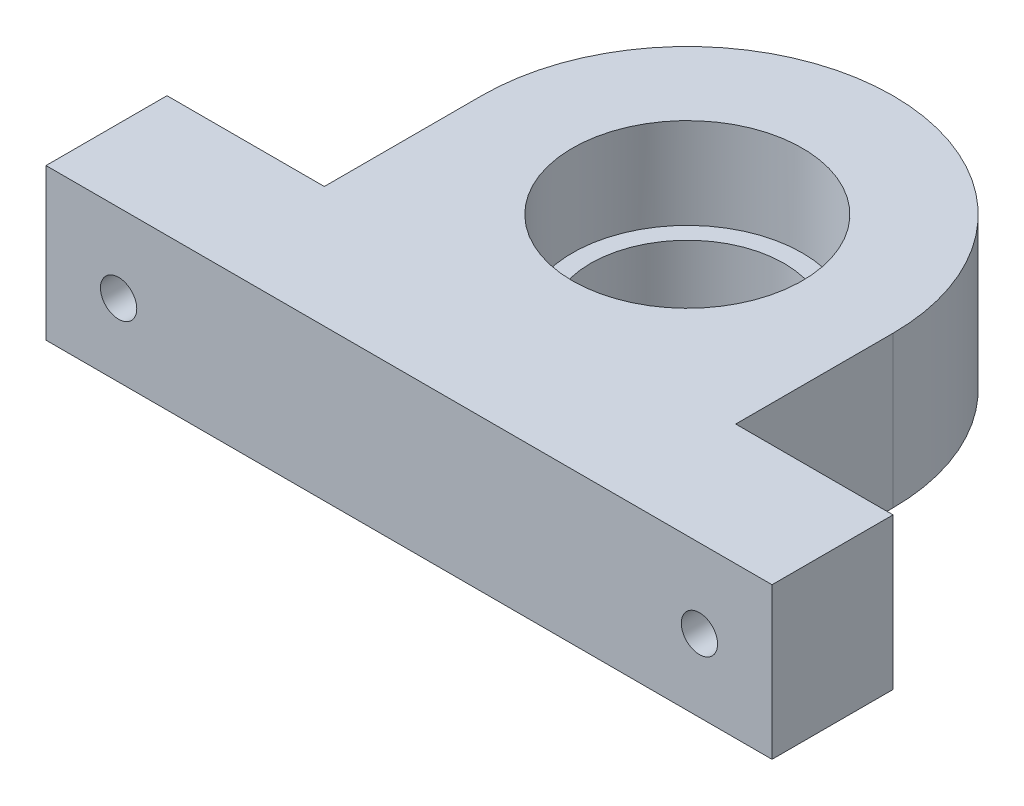
ISO-10303-21;
HEADER;
FILE_DESCRIPTION(('STEP AP214'),'2;1');
FILE_NAME('part.step','',(''),(''),'','','');
FILE_SCHEMA(('AUTOMOTIVE_DESIGN { 1 0 10303 214 1 1 1 1 }'));
ENDSEC;
DATA;
#1=APPLICATION_CONTEXT('core data for automotive mechanical design processes');
#2=APPLICATION_PROTOCOL_DEFINITION('international standard','automotive_design',2000,#1);
#3=PRODUCT_CONTEXT('',#1,'mechanical');
#4=PRODUCT('Part','Part','',(#3));
#5=PRODUCT_RELATED_PRODUCT_CATEGORY('part','',(#4));
#6=PRODUCT_DEFINITION_FORMATION('','',#4);
#7=PRODUCT_DEFINITION_CONTEXT('part definition',#1,'design');
#8=PRODUCT_DEFINITION('design','',#6,#7);
#9=PRODUCT_DEFINITION_SHAPE('','',#8);
#10=(LENGTH_UNIT() NAMED_UNIT(*) SI_UNIT(.MILLI.,.METRE.));
#11=(NAMED_UNIT(*) PLANE_ANGLE_UNIT() SI_UNIT($,.RADIAN.));
#12=(NAMED_UNIT(*) SI_UNIT($,.STERADIAN.) SOLID_ANGLE_UNIT());
#13=UNCERTAINTY_MEASURE_WITH_UNIT(LENGTH_MEASURE(1.E-05),#10,'distance_accuracy_value','');
#14=(GEOMETRIC_REPRESENTATION_CONTEXT(3) GLOBAL_UNCERTAINTY_ASSIGNED_CONTEXT((#13)) GLOBAL_UNIT_ASSIGNED_CONTEXT((#10,
#11,#12)) REPRESENTATION_CONTEXT('',''));
#15=CARTESIAN_POINT('',(0.,0.,0.));
#16=DIRECTION('',(0.,0.,1.));
#17=DIRECTION('',(1.,0.,0.));
#18=AXIS2_PLACEMENT_3D('',#15,#16,#17);
#19=CARTESIAN_POINT('',(0.,-4.37005768508881,-13.));
#20=DIRECTION('',(0.,1.,0.));
#21=DIRECTION('',(0.,0.,1.));
#22=AXIS2_PLACEMENT_3D('',#19,#20,#21);
#23=CYLINDRICAL_SURFACE('',#22,9.5);
#24=CARTESIAN_POINT('',(0.,35.,-13.));
#25=DIRECTION('',(0.,1.,0.));
#26=DIRECTION('',(0.,0.,1.));
#27=AXIS2_PLACEMENT_3D('',#24,#25,#26);
#28=CIRCLE('',#27,9.5);
#29=CARTESIAN_POINT('',(0.,35.,-3.5));
#30=VERTEX_POINT('',#29);
#31=EDGE_CURVE('E182',#30,#30,#28,.T.);
#32=ORIENTED_EDGE('',*,*,#31,.T.);
#33=EDGE_LOOP('',(#32));
#34=FACE_BOUND('',#33,.T.);
#35=CARTESIAN_POINT('',(0.,27.5,-13.));
#36=DIRECTION('',(0.,-1.,0.));
#37=DIRECTION('',(0.,0.,-1.));
#38=AXIS2_PLACEMENT_3D('',#35,#36,#37);
#39=CIRCLE('',#38,9.5);
#40=CARTESIAN_POINT('',(0.,27.5,-22.5));
#41=VERTEX_POINT('',#40);
#42=EDGE_CURVE('E11',#41,#41,#39,.F.);
#43=ORIENTED_EDGE('',*,*,#42,.F.);
#44=EDGE_LOOP('',(#43));
#45=FACE_BOUND('',#44,.T.);
#46=ADVANCED_FACE('F47',(#34,#45),#23,.F.);
#47=CARTESIAN_POINT('',(-30.,35.,10.));
#48=DIRECTION('',(0.,-1.,0.));
#49=DIRECTION('',(0.,0.,-1.));
#50=AXIS2_PLACEMENT_3D('',#47,#48,#49);
#51=PLANE('',#50);
#52=ORIENTED_EDGE('',*,*,#31,.F.);
#53=EDGE_LOOP('',(#52));
#54=FACE_BOUND('',#53,.T.);
#55=DIRECTION('',(-1.,0.,0.));
#56=VECTOR('',#55,1.);
#57=CARTESIAN_POINT('',(-17.,35.,0.));
#58=LINE('',#57,#56);
#59=CARTESIAN_POINT('',(-17.,35.,0.));
#60=VERTEX_POINT('',#59);
#61=CARTESIAN_POINT('',(-30.,35.,0.));
#62=VERTEX_POINT('',#61);
#63=EDGE_CURVE('E120',#60,#62,#58,.T.);
#64=ORIENTED_EDGE('',*,*,#63,.T.);
#65=DIRECTION('',(0.,0.,-1.));
#66=VECTOR('',#65,1.);
#67=CARTESIAN_POINT('',(-30.,35.,10.));
#68=LINE('',#67,#66);
#69=CARTESIAN_POINT('',(-30.,35.,10.));
#70=VERTEX_POINT('',#69);
#71=EDGE_CURVE('E211',#70,#62,#68,.T.);
#72=ORIENTED_EDGE('',*,*,#71,.F.);
#73=DIRECTION('',(-1.,0.,0.));
#74=VECTOR('',#73,1.);
#75=CARTESIAN_POINT('',(-30.,35.,10.));
#76=LINE('',#75,#74);
#77=CARTESIAN_POINT('',(30.,35.,10.));
#78=VERTEX_POINT('',#77);
#79=EDGE_CURVE('E63',#78,#70,#76,.T.);
#80=ORIENTED_EDGE('',*,*,#79,.F.);
#81=DIRECTION('',(0.,0.,-1.));
#82=VECTOR('',#81,1.);
#83=CARTESIAN_POINT('',(30.,35.,10.));
#84=LINE('',#83,#82);
#85=CARTESIAN_POINT('',(30.,35.,0.));
#86=VERTEX_POINT('',#85);
#87=EDGE_CURVE('E56',#78,#86,#84,.T.);
#88=ORIENTED_EDGE('',*,*,#87,.T.);
#89=DIRECTION('',(1.,0.,0.));
#90=VECTOR('',#89,1.);
#91=CARTESIAN_POINT('',(17.,35.,0.));
#92=LINE('',#91,#90);
#93=CARTESIAN_POINT('',(17.,35.,0.));
#94=VERTEX_POINT('',#93);
#95=EDGE_CURVE('E162',#94,#86,#92,.T.);
#96=ORIENTED_EDGE('',*,*,#95,.F.);
#97=DIRECTION('',(0.,0.,-1.));
#98=VECTOR('',#97,1.);
#99=CARTESIAN_POINT('',(17.,35.,0.));
#100=LINE('',#99,#98);
#101=CARTESIAN_POINT('',(17.,35.,-13.));
#102=VERTEX_POINT('',#101);
#103=EDGE_CURVE('E157',#94,#102,#100,.T.);
#104=ORIENTED_EDGE('',*,*,#103,.T.);
#105=CARTESIAN_POINT('',(0.,35.,-13.));
#106=DIRECTION('',(0.,1.,0.));
#107=DIRECTION('',(0.,0.,1.));
#108=AXIS2_PLACEMENT_3D('',#105,#106,#107);
#109=CIRCLE('',#108,17.);
#110=CARTESIAN_POINT('',(-17.,35.,-13.));
#111=VERTEX_POINT('',#110);
#112=EDGE_CURVE('E186',#111,#102,#109,.F.);
#113=ORIENTED_EDGE('',*,*,#112,.F.);
#114=DIRECTION('',(0.,0.,-1.));
#115=VECTOR('',#114,1.);
#116=CARTESIAN_POINT('',(-17.,35.,0.));
#117=LINE('',#116,#115);
#118=EDGE_CURVE('E124',#60,#111,#117,.T.);
#119=ORIENTED_EDGE('',*,*,#118,.F.);
#120=EDGE_LOOP('',(#64,#72,#80,#88,#96,#104,#113,#119));
#121=FACE_BOUND('',#120,.T.);
#122=ADVANCED_FACE('F241',(#54,#121),#51,.F.);
#123=CARTESIAN_POINT('',(0.,22.5,4.));
#124=DIRECTION('',(0.,1.,0.));
#125=DIRECTION('',(0.,0.,1.));
#126=AXIS2_PLACEMENT_3D('',#123,#124,#125);
#127=PLANE('',#126);
#128=DIRECTION('',(-1.,0.,0.));
#129=VECTOR('',#128,1.);
#130=CARTESIAN_POINT('',(-17.,22.5,0.));
#131=LINE('',#130,#129);
#132=CARTESIAN_POINT('',(-17.,22.5,0.));
#133=VERTEX_POINT('',#132);
#134=CARTESIAN_POINT('',(-30.,22.5,0.));
#135=VERTEX_POINT('',#134);
#136=EDGE_CURVE('E117',#133,#135,#131,.T.);
#137=ORIENTED_EDGE('',*,*,#136,.F.);
#138=DIRECTION('',(0.,0.,-1.));
#139=VECTOR('',#138,1.);
#140=CARTESIAN_POINT('',(-17.,22.5,0.));
#141=LINE('',#140,#139);
#142=CARTESIAN_POINT('',(-17.,22.5,-13.));
#143=VERTEX_POINT('',#142);
#144=EDGE_CURVE('E125',#133,#143,#141,.T.);
#145=ORIENTED_EDGE('',*,*,#144,.T.);
#146=CARTESIAN_POINT('',(0.,22.5,-13.));
#147=DIRECTION('',(0.,1.,0.));
#148=DIRECTION('',(0.,0.,1.));
#149=AXIS2_PLACEMENT_3D('',#146,#147,#148);
#150=CIRCLE('',#149,17.);
#151=CARTESIAN_POINT('',(17.,22.5,-13.));
#152=VERTEX_POINT('',#151);
#153=EDGE_CURVE('E187',#143,#152,#150,.F.);
#154=ORIENTED_EDGE('',*,*,#153,.T.);
#155=DIRECTION('',(0.,0.,-1.));
#156=VECTOR('',#155,1.);
#157=CARTESIAN_POINT('',(17.,22.5,0.));
#158=LINE('',#157,#156);
#159=CARTESIAN_POINT('',(17.,22.5,0.));
#160=VERTEX_POINT('',#159);
#161=EDGE_CURVE('E154',#160,#152,#158,.T.);
#162=ORIENTED_EDGE('',*,*,#161,.F.);
#163=DIRECTION('',(1.,0.,0.));
#164=VECTOR('',#163,1.);
#165=CARTESIAN_POINT('',(17.,22.5,0.));
#166=LINE('',#165,#164);
#167=CARTESIAN_POINT('',(30.,22.5,0.));
#168=VERTEX_POINT('',#167);
#169=EDGE_CURVE('E161',#160,#168,#166,.T.);
#170=ORIENTED_EDGE('',*,*,#169,.T.);
#171=DIRECTION('',(0.,0.,-1.));
#172=VECTOR('',#171,1.);
#173=CARTESIAN_POINT('',(30.,22.5,4.));
#174=LINE('',#173,#172);
#175=CARTESIAN_POINT('',(30.,22.5,10.));
#176=VERTEX_POINT('',#175);
#177=EDGE_CURVE('E196',#176,#168,#174,.T.);
#178=ORIENTED_EDGE('',*,*,#177,.F.);
#179=DIRECTION('',(-1.,0.,0.));
#180=VECTOR('',#179,1.);
#181=CARTESIAN_POINT('',(30.,22.5,10.));
#182=LINE('',#181,#180);
#183=CARTESIAN_POINT('',(-30.,22.5,10.));
#184=VERTEX_POINT('',#183);
#185=EDGE_CURVE('E179',#176,#184,#182,.T.);
#186=ORIENTED_EDGE('',*,*,#185,.T.);
#187=DIRECTION('',(0.,0.,-1.));
#188=VECTOR('',#187,1.);
#189=CARTESIAN_POINT('',(-30.,22.5,10.));
#190=LINE('',#189,#188);
#191=EDGE_CURVE('E140',#184,#135,#190,.T.);
#192=ORIENTED_EDGE('',*,*,#191,.T.);
#193=EDGE_LOOP('',(#137,#145,#154,#162,#170,#178,#186,#192));
#194=FACE_BOUND('',#193,.T.);
#195=CARTESIAN_POINT('',(0.,22.5,-13.));
#196=DIRECTION('',(0.,-1.,0.));
#197=DIRECTION('',(0.,0.,-1.));
#198=AXIS2_PLACEMENT_3D('',#195,#196,#197);
#199=CIRCLE('',#198,8.);
#200=CARTESIAN_POINT('',(0.,22.5,-21.));
#201=VERTEX_POINT('',#200);
#202=EDGE_CURVE('E429',#201,#201,#199,.T.);
#203=ORIENTED_EDGE('',*,*,#202,.F.);
#204=EDGE_LOOP('',(#203));
#205=FACE_BOUND('',#204,.T.);
#206=ADVANCED_FACE('F137',(#194,#205),#127,.F.);
#207=CARTESIAN_POINT('',(-24.,28.5,-30.));
#208=DIRECTION('',(0.,0.,1.));
#209=DIRECTION('',(1.,0.,0.));
#210=AXIS2_PLACEMENT_3D('',#207,#208,#209);
#211=CYLINDRICAL_SURFACE('',#210,1.5);
#212=CARTESIAN_POINT('',(-24.,28.5,10.));
#213=DIRECTION('',(0.,0.,1.));
#214=DIRECTION('',(1.,0.,0.));
#215=AXIS2_PLACEMENT_3D('',#212,#213,#214);
#216=CIRCLE('',#215,1.5);
#217=CARTESIAN_POINT('',(-22.5,28.5,10.));
#218=VERTEX_POINT('',#217);
#219=EDGE_CURVE('E173',#218,#218,#216,.T.);
#220=ORIENTED_EDGE('',*,*,#219,.T.);
#221=EDGE_LOOP('',(#220));
#222=FACE_BOUND('',#221,.T.);
#223=CARTESIAN_POINT('',(-24.,28.5,0.));
#224=DIRECTION('',(0.,0.,-1.));
#225=DIRECTION('',(-1.,0.,0.));
#226=AXIS2_PLACEMENT_3D('',#223,#224,#225);
#227=CIRCLE('',#226,1.5);
#228=CARTESIAN_POINT('',(-25.5,28.5,0.));
#229=VERTEX_POINT('',#228);
#230=EDGE_CURVE('E146',#229,#229,#227,.F.);
#231=ORIENTED_EDGE('',*,*,#230,.F.);
#232=EDGE_LOOP('',(#231));
#233=FACE_BOUND('',#232,.T.);
#234=ADVANCED_FACE('F229',(#222,#233),#211,.F.);
#235=CARTESIAN_POINT('',(24.,28.5,-30.));
#236=DIRECTION('',(0.,0.,1.));
#237=DIRECTION('',(1.,0.,0.));
#238=AXIS2_PLACEMENT_3D('',#235,#236,#237);
#239=CYLINDRICAL_SURFACE('',#238,1.5);
#240=CARTESIAN_POINT('',(24.,28.5,10.));
#241=DIRECTION('',(0.,0.,1.));
#242=DIRECTION('',(1.,0.,0.));
#243=AXIS2_PLACEMENT_3D('',#240,#241,#242);
#244=CIRCLE('',#243,1.5);
#245=CARTESIAN_POINT('',(25.5,28.5,10.));
#246=VERTEX_POINT('',#245);
#247=EDGE_CURVE('E169',#246,#246,#244,.T.);
#248=ORIENTED_EDGE('',*,*,#247,.T.);
#249=EDGE_LOOP('',(#248));
#250=FACE_BOUND('',#249,.T.);
#251=CARTESIAN_POINT('',(24.,28.5,0.));
#252=DIRECTION('',(0.,0.,-1.));
#253=DIRECTION('',(-1.,0.,0.));
#254=AXIS2_PLACEMENT_3D('',#251,#252,#253);
#255=CIRCLE('',#254,1.5);
#256=CARTESIAN_POINT('',(22.5,28.5,0.));
#257=VERTEX_POINT('',#256);
#258=EDGE_CURVE('E165',#257,#257,#255,.F.);
#259=ORIENTED_EDGE('',*,*,#258,.F.);
#260=EDGE_LOOP('',(#259));
#261=FACE_BOUND('',#260,.T.);
#262=ADVANCED_FACE('F231',(#250,#261),#239,.F.);
#263=CARTESIAN_POINT('',(-30.,35.,10.));
#264=DIRECTION('',(1.,0.,0.));
#265=DIRECTION('',(0.,1.,0.));
#266=AXIS2_PLACEMENT_3D('',#263,#264,#265);
#267=PLANE('',#266);
#268=DIRECTION('',(0.,-1.,0.));
#269=VECTOR('',#268,1.);
#270=CARTESIAN_POINT('',(-30.,35.,0.));
#271=LINE('',#270,#269);
#272=EDGE_CURVE('E205',#62,#135,#271,.T.);
#273=ORIENTED_EDGE('',*,*,#272,.T.);
#274=ORIENTED_EDGE('',*,*,#191,.F.);
#275=DIRECTION('',(0.,-1.,0.));
#276=VECTOR('',#275,1.);
#277=CARTESIAN_POINT('',(-30.,35.,10.));
#278=LINE('',#277,#276);
#279=EDGE_CURVE('E208',#70,#184,#278,.T.);
#280=ORIENTED_EDGE('',*,*,#279,.F.);
#281=ORIENTED_EDGE('',*,*,#71,.T.);
#282=EDGE_LOOP('',(#273,#274,#280,#281));
#283=FACE_BOUND('',#282,.T.);
#284=ADVANCED_FACE('F238',(#283),#267,.F.);
#285=CARTESIAN_POINT('',(0.,0.,10.));
#286=DIRECTION('',(0.,0.,1.));
#287=DIRECTION('',(1.,0.,0.));
#288=AXIS2_PLACEMENT_3D('',#285,#286,#287);
#289=PLANE('',#288);
#290=ORIENTED_EDGE('',*,*,#247,.F.);
#291=EDGE_LOOP('',(#290));
#292=FACE_BOUND('',#291,.T.);
#293=ORIENTED_EDGE('',*,*,#219,.F.);
#294=EDGE_LOOP('',(#293));
#295=FACE_BOUND('',#294,.T.);
#296=ORIENTED_EDGE('',*,*,#185,.F.);
#297=DIRECTION('',(0.,1.,0.));
#298=VECTOR('',#297,1.);
#299=CARTESIAN_POINT('',(30.,35.,10.));
#300=LINE('',#299,#298);
#301=EDGE_CURVE('E68',#176,#78,#300,.T.);
#302=ORIENTED_EDGE('',*,*,#301,.T.);
#303=ORIENTED_EDGE('',*,*,#79,.T.);
#304=ORIENTED_EDGE('',*,*,#279,.T.);
#305=EDGE_LOOP('',(#296,#302,#303,#304));
#306=FACE_BOUND('',#305,.T.);
#307=ADVANCED_FACE('F259',(#292,#295,#306),#289,.T.);
#308=CARTESIAN_POINT('',(30.,35.,10.));
#309=DIRECTION('',(-1.,0.,0.));
#310=DIRECTION('',(0.,-1.,0.));
#311=AXIS2_PLACEMENT_3D('',#308,#309,#310);
#312=PLANE('',#311);
#313=ORIENTED_EDGE('',*,*,#301,.F.);
#314=ORIENTED_EDGE('',*,*,#177,.T.);
#315=DIRECTION('',(0.,1.,0.));
#316=VECTOR('',#315,1.);
#317=CARTESIAN_POINT('',(30.,35.,0.));
#318=LINE('',#317,#316);
#319=EDGE_CURVE('E202',#168,#86,#318,.T.);
#320=ORIENTED_EDGE('',*,*,#319,.T.);
#321=ORIENTED_EDGE('',*,*,#87,.F.);
#322=EDGE_LOOP('',(#313,#314,#320,#321));
#323=FACE_BOUND('',#322,.T.);
#324=ADVANCED_FACE('F49',(#323),#312,.F.);
#325=CARTESIAN_POINT('',(0.,22.5,-13.));
#326=DIRECTION('',(0.,1.,0.));
#327=DIRECTION('',(0.,0.,1.));
#328=AXIS2_PLACEMENT_3D('',#325,#326,#327);
#329=CYLINDRICAL_SURFACE('',#328,17.);
#330=ORIENTED_EDGE('',*,*,#112,.T.);
#331=DIRECTION('',(0.,1.,0.));
#332=VECTOR('',#331,1.);
#333=CARTESIAN_POINT('',(17.,22.5,-13.));
#334=LINE('',#333,#332);
#335=EDGE_CURVE('E190',#152,#102,#334,.T.);
#336=ORIENTED_EDGE('',*,*,#335,.F.);
#337=ORIENTED_EDGE('',*,*,#153,.F.);
#338=DIRECTION('',(0.,1.,0.));
#339=VECTOR('',#338,1.);
#340=CARTESIAN_POINT('',(-17.,22.5,-13.));
#341=LINE('',#340,#339);
#342=EDGE_CURVE('E130',#143,#111,#341,.T.);
#343=ORIENTED_EDGE('',*,*,#342,.T.);
#344=EDGE_LOOP('',(#330,#336,#337,#343));
#345=FACE_BOUND('',#344,.T.);
#346=ADVANCED_FACE('F254',(#345),#329,.T.);
#347=CARTESIAN_POINT('',(17.,0.,0.));
#348=DIRECTION('',(0.,0.,-1.));
#349=DIRECTION('',(-1.,0.,0.));
#350=AXIS2_PLACEMENT_3D('',#347,#348,#349);
#351=PLANE('',#350);
#352=ORIENTED_EDGE('',*,*,#319,.F.);
#353=ORIENTED_EDGE('',*,*,#169,.F.);
#354=DIRECTION('',(0.,1.,0.));
#355=VECTOR('',#354,1.);
#356=CARTESIAN_POINT('',(17.,0.,0.));
#357=LINE('',#356,#355);
#358=EDGE_CURVE('E150',#160,#94,#357,.T.);
#359=ORIENTED_EDGE('',*,*,#358,.T.);
#360=ORIENTED_EDGE('',*,*,#95,.T.);
#361=EDGE_LOOP('',(#352,#353,#359,#360));
#362=FACE_BOUND('',#361,.T.);
#363=ORIENTED_EDGE('',*,*,#258,.T.);
#364=EDGE_LOOP('',(#363));
#365=FACE_BOUND('',#364,.T.);
#366=ADVANCED_FACE('F256',(#362,#365),#351,.T.);
#367=CARTESIAN_POINT('',(17.,0.,0.));
#368=DIRECTION('',(1.,0.,0.));
#369=DIRECTION('',(0.,1.,0.));
#370=AXIS2_PLACEMENT_3D('',#367,#368,#369);
#371=PLANE('',#370);
#372=ORIENTED_EDGE('',*,*,#358,.F.);
#373=ORIENTED_EDGE('',*,*,#161,.T.);
#374=ORIENTED_EDGE('',*,*,#335,.T.);
#375=ORIENTED_EDGE('',*,*,#103,.F.);
#376=EDGE_LOOP('',(#372,#373,#374,#375));
#377=FACE_BOUND('',#376,.T.);
#378=ADVANCED_FACE('F274',(#377),#371,.T.);
#379=CARTESIAN_POINT('',(-17.,0.,0.));
#380=DIRECTION('',(0.,0.,-1.));
#381=DIRECTION('',(-1.,0.,0.));
#382=AXIS2_PLACEMENT_3D('',#379,#380,#381);
#383=PLANE('',#382);
#384=ORIENTED_EDGE('',*,*,#272,.F.);
#385=ORIENTED_EDGE('',*,*,#63,.F.);
#386=DIRECTION('',(0.,-1.,0.));
#387=VECTOR('',#386,1.);
#388=CARTESIAN_POINT('',(-17.,0.,0.));
#389=LINE('',#388,#387);
#390=EDGE_CURVE('E112',#60,#133,#389,.T.);
#391=ORIENTED_EDGE('',*,*,#390,.T.);
#392=ORIENTED_EDGE('',*,*,#136,.T.);
#393=EDGE_LOOP('',(#384,#385,#391,#392));
#394=FACE_BOUND('',#393,.T.);
#395=ORIENTED_EDGE('',*,*,#230,.T.);
#396=EDGE_LOOP('',(#395));
#397=FACE_BOUND('',#396,.T.);
#398=ADVANCED_FACE('F114',(#394,#397),#383,.T.);
#399=CARTESIAN_POINT('',(-17.,0.,0.));
#400=DIRECTION('',(-1.,0.,0.));
#401=DIRECTION('',(0.,-1.,0.));
#402=AXIS2_PLACEMENT_3D('',#399,#400,#401);
#403=PLANE('',#402);
#404=ORIENTED_EDGE('',*,*,#144,.F.);
#405=ORIENTED_EDGE('',*,*,#390,.F.);
#406=ORIENTED_EDGE('',*,*,#118,.T.);
#407=ORIENTED_EDGE('',*,*,#342,.F.);
#408=EDGE_LOOP('',(#404,#405,#406,#407));
#409=FACE_BOUND('',#408,.T.);
#410=ADVANCED_FACE('F128',(#409),#403,.T.);
#411=CARTESIAN_POINT('',(0.,27.5,-13.));
#412=DIRECTION('',(0.,-1.,0.));
#413=DIRECTION('',(0.,0.,-1.));
#414=AXIS2_PLACEMENT_3D('',#411,#412,#413);
#415=PLANE('',#414);
#416=CARTESIAN_POINT('',(0.,27.5,-13.));
#417=DIRECTION('',(0.,-1.,0.));
#418=DIRECTION('',(0.,0.,-1.));
#419=AXIS2_PLACEMENT_3D('',#416,#417,#418);
#420=CIRCLE('',#419,8.);
#421=CARTESIAN_POINT('',(0.,27.5,-21.));
#422=VERTEX_POINT('',#421);
#423=EDGE_CURVE('E135',#422,#422,#420,.T.);
#424=ORIENTED_EDGE('',*,*,#423,.T.);
#425=EDGE_LOOP('',(#424));
#426=FACE_BOUND('',#425,.T.);
#427=ORIENTED_EDGE('',*,*,#42,.T.);
#428=EDGE_LOOP('',(#427));
#429=FACE_BOUND('',#428,.T.);
#430=ADVANCED_FACE('F345',(#426,#429),#415,.F.);
#431=CARTESIAN_POINT('',(0.,27.5,-13.));
#432=DIRECTION('',(0.,-1.,0.));
#433=DIRECTION('',(0.,0.,-1.));
#434=AXIS2_PLACEMENT_3D('',#431,#432,#433);
#435=CYLINDRICAL_SURFACE('',#434,8.);
#436=ORIENTED_EDGE('',*,*,#423,.F.);
#437=EDGE_LOOP('',(#436));
#438=FACE_BOUND('',#437,.T.);
#439=ORIENTED_EDGE('',*,*,#202,.T.);
#440=EDGE_LOOP('',(#439));
#441=FACE_BOUND('',#440,.T.);
#442=ADVANCED_FACE('F359',(#438,#441),#435,.F.);
#443=CLOSED_SHELL('',(#46,#122,#206,#234,#262,#284,#307,#324,#346,#366,#378,#398,#410,#430,#442));
#444=MANIFOLD_SOLID_BREP('B2',#443);
#445=ADVANCED_BREP_SHAPE_REPRESENTATION('',(#18,#444),#14);
#446=SHAPE_DEFINITION_REPRESENTATION(#9,#445);
ENDSEC;
END-ISO-10303-21;
